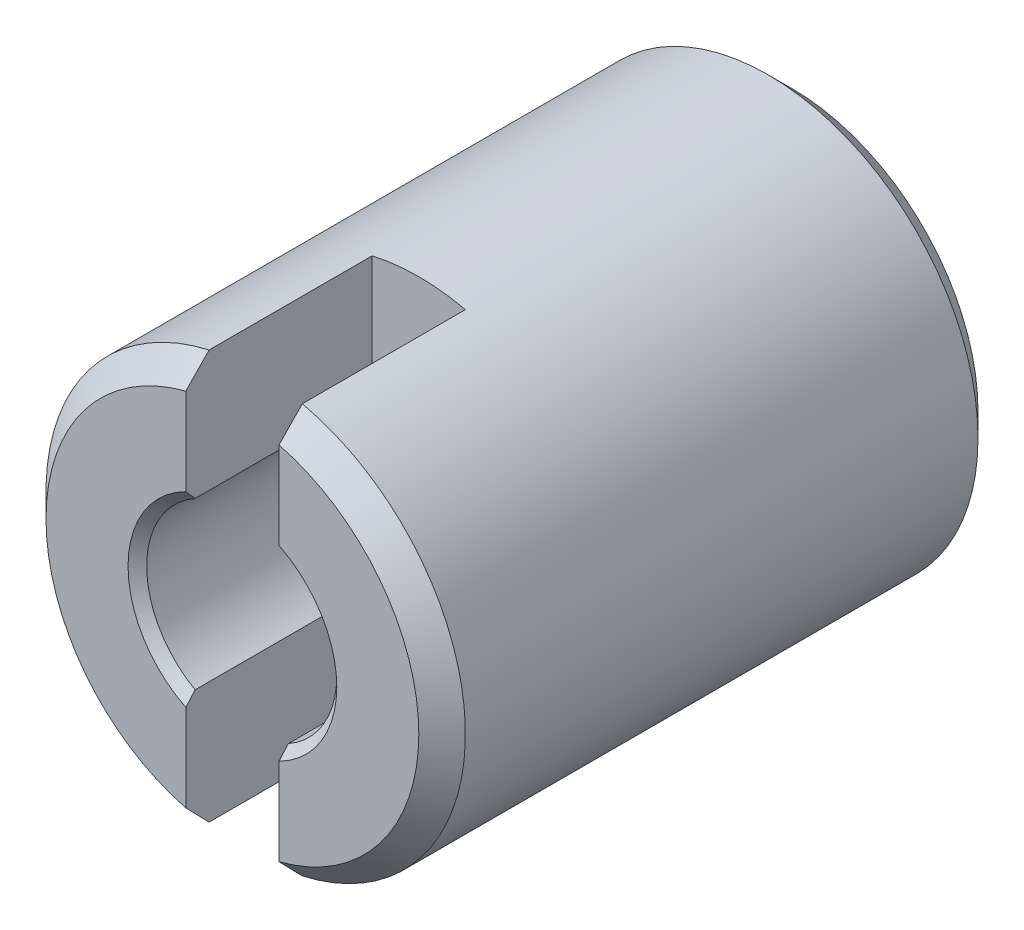
ISO-10303-21;
HEADER;
FILE_DESCRIPTION(('STEP AP214'),'2;1');
FILE_NAME('part.step','',(''),(''),'','','');
FILE_SCHEMA(('AUTOMOTIVE_DESIGN { 1 0 10303 214 1 1 1 1 }'));
ENDSEC;
DATA;
#1=APPLICATION_CONTEXT('core data for automotive mechanical design processes');
#2=APPLICATION_PROTOCOL_DEFINITION('international standard','automotive_design',2000,#1);
#3=PRODUCT_CONTEXT('',#1,'mechanical');
#4=PRODUCT('Part','Part','',(#3));
#5=PRODUCT_RELATED_PRODUCT_CATEGORY('part','',(#4));
#6=PRODUCT_DEFINITION_FORMATION('','',#4);
#7=PRODUCT_DEFINITION_CONTEXT('part definition',#1,'design');
#8=PRODUCT_DEFINITION('design','',#6,#7);
#9=PRODUCT_DEFINITION_SHAPE('','',#8);
#10=(LENGTH_UNIT() NAMED_UNIT(*) SI_UNIT(.MILLI.,.METRE.));
#11=(NAMED_UNIT(*) PLANE_ANGLE_UNIT() SI_UNIT($,.RADIAN.));
#12=(NAMED_UNIT(*) SI_UNIT($,.STERADIAN.) SOLID_ANGLE_UNIT());
#13=UNCERTAINTY_MEASURE_WITH_UNIT(LENGTH_MEASURE(1.E-05),#10,'distance_accuracy_value','');
#14=(GEOMETRIC_REPRESENTATION_CONTEXT(3) GLOBAL_UNCERTAINTY_ASSIGNED_CONTEXT((#13)) GLOBAL_UNIT_ASSIGNED_CONTEXT((#10,
#11,#12)) REPRESENTATION_CONTEXT('',''));
#15=CARTESIAN_POINT('',(0.,0.,0.));
#16=DIRECTION('',(0.,0.,1.));
#17=DIRECTION('',(1.,0.,0.));
#18=AXIS2_PLACEMENT_3D('',#15,#16,#17);
#19=CARTESIAN_POINT('',(0.,0.,6.));
#20=DIRECTION('',(0.,0.,1.));
#21=DIRECTION('',(1.,0.,0.));
#22=AXIS2_PLACEMENT_3D('',#19,#20,#21);
#23=PLANE('',#22);
#24=DIRECTION('',(0.,-1.,0.));
#25=VECTOR('',#24,1.);
#26=CARTESIAN_POINT('',(-0.5,-2.5,6.));
#27=LINE('',#26,#25);
#28=CARTESIAN_POINT('',(-0.5,-1.00219758530941,6.));
#29=VERTEX_POINT('',#28);
#30=CARTESIAN_POINT('',(-0.5,-1.93649167310371,6.));
#31=VERTEX_POINT('',#30);
#32=EDGE_CURVE('E166',#29,#31,#27,.T.);
#33=ORIENTED_EDGE('',*,*,#32,.F.);
#34=CARTESIAN_POINT('',(0.,0.,6.));
#35=DIRECTION('',(0.,0.,1.));
#36=DIRECTION('',(1.,0.,0.));
#37=AXIS2_PLACEMENT_3D('',#34,#35,#36);
#38=CIRCLE('',#37,1.12);
#39=CARTESIAN_POINT('',(-0.5,1.00219758530941,6.));
#40=VERTEX_POINT('',#39);
#41=EDGE_CURVE('E50',#29,#40,#38,.F.);
#42=ORIENTED_EDGE('',*,*,#41,.T.);
#43=CARTESIAN_POINT('',(-0.5,1.93649167310371,6.));
#44=VERTEX_POINT('',#43);
#45=EDGE_CURVE('E168',#44,#40,#27,.T.);
#46=ORIENTED_EDGE('',*,*,#45,.F.);
#47=CARTESIAN_POINT('',(0.,0.,6.));
#48=DIRECTION('',(0.,0.,1.));
#49=DIRECTION('',(1.,0.,0.));
#50=AXIS2_PLACEMENT_3D('',#47,#48,#49);
#51=CIRCLE('',#50,2.);
#52=EDGE_CURVE('E275',#44,#31,#51,.T.);
#53=ORIENTED_EDGE('',*,*,#52,.T.);
#54=EDGE_LOOP('',(#33,#42,#46,#53));
#55=FACE_BOUND('',#54,.T.);
#56=ADVANCED_FACE('F36',(#55),#23,.T.);
#57=CARTESIAN_POINT('',(0.,0.,6.));
#58=DIRECTION('',(0.,0.,-1.));
#59=DIRECTION('',(-1.,0.,0.));
#60=AXIS2_PLACEMENT_3D('',#57,#58,#59);
#61=CYLINDRICAL_SURFACE('',#60,2.25);
#62=CARTESIAN_POINT('',(0.,0.,0.249999999999999));
#63=DIRECTION('',(0.,0.,1.));
#64=DIRECTION('',(1.,0.,0.));
#65=AXIS2_PLACEMENT_3D('',#62,#63,#64);
#66=CIRCLE('',#65,2.25);
#67=CARTESIAN_POINT('',(2.25,0.,0.249999999999999));
#68=VERTEX_POINT('',#67);
#69=EDGE_CURVE('E298',#68,#68,#66,.T.);
#70=ORIENTED_EDGE('',*,*,#69,.T.);
#71=EDGE_LOOP('',(#70));
#72=FACE_BOUND('',#71,.T.);
#73=DIRECTION('',(0.,0.,-1.));
#74=VECTOR('',#73,1.);
#75=CARTESIAN_POINT('',(-0.5,-2.19374109684803,6.));
#76=LINE('',#75,#74);
#77=CARTESIAN_POINT('',(-0.5,-2.19374109684803,4.));
#78=VERTEX_POINT('',#77);
#79=CARTESIAN_POINT('',(-0.5,-2.19374109684803,5.75));
#80=VERTEX_POINT('',#79);
#81=EDGE_CURVE('E142',#78,#80,#76,.F.);
#82=ORIENTED_EDGE('',*,*,#81,.T.);
#83=CARTESIAN_POINT('',(0.,0.,5.75));
#84=DIRECTION('',(0.,0.,1.));
#85=DIRECTION('',(1.,0.,0.));
#86=AXIS2_PLACEMENT_3D('',#83,#84,#85);
#87=CIRCLE('',#86,2.25);
#88=CARTESIAN_POINT('',(-0.5,2.19374109684803,5.75));
#89=VERTEX_POINT('',#88);
#90=EDGE_CURVE('E137',#80,#89,#87,.F.);
#91=ORIENTED_EDGE('',*,*,#90,.T.);
#92=DIRECTION('',(0.,0.,-1.));
#93=VECTOR('',#92,1.);
#94=CARTESIAN_POINT('',(-0.5,2.19374109684803,6.));
#95=LINE('',#94,#93);
#96=CARTESIAN_POINT('',(-0.5,2.19374109684803,4.));
#97=VERTEX_POINT('',#96);
#98=EDGE_CURVE('E130',#89,#97,#95,.T.);
#99=ORIENTED_EDGE('',*,*,#98,.T.);
#100=CARTESIAN_POINT('',(0.,0.,4.));
#101=DIRECTION('',(0.,0.,1.));
#102=DIRECTION('',(1.,0.,0.));
#103=AXIS2_PLACEMENT_3D('',#100,#101,#102);
#104=CIRCLE('',#103,2.25);
#105=CARTESIAN_POINT('',(0.5,2.19374109684803,4.));
#106=VERTEX_POINT('',#105);
#107=EDGE_CURVE('E135',#106,#97,#104,.T.);
#108=ORIENTED_EDGE('',*,*,#107,.F.);
#109=DIRECTION('',(0.,0.,-1.));
#110=VECTOR('',#109,1.);
#111=CARTESIAN_POINT('',(0.5,2.19374109684803,6.));
#112=LINE('',#111,#110);
#113=CARTESIAN_POINT('',(0.5,2.19374109684803,5.75));
#114=VERTEX_POINT('',#113);
#115=EDGE_CURVE('E152',#106,#114,#112,.F.);
#116=ORIENTED_EDGE('',*,*,#115,.T.);
#117=CARTESIAN_POINT('',(0.,0.,5.75));
#118=DIRECTION('',(0.,0.,1.));
#119=DIRECTION('',(1.,0.,0.));
#120=AXIS2_PLACEMENT_3D('',#117,#118,#119);
#121=CIRCLE('',#120,2.25);
#122=CARTESIAN_POINT('',(0.5,-2.19374109684803,5.75));
#123=VERTEX_POINT('',#122);
#124=EDGE_CURVE('E197',#114,#123,#121,.F.);
#125=ORIENTED_EDGE('',*,*,#124,.T.);
#126=DIRECTION('',(0.,0.,-1.));
#127=VECTOR('',#126,1.);
#128=CARTESIAN_POINT('',(0.5,-2.19374109684803,6.));
#129=LINE('',#128,#127);
#130=CARTESIAN_POINT('',(0.5,-2.19374109684803,4.));
#131=VERTEX_POINT('',#130);
#132=EDGE_CURVE('E173',#123,#131,#129,.T.);
#133=ORIENTED_EDGE('',*,*,#132,.T.);
#134=EDGE_CURVE('E153',#78,#131,#104,.T.);
#135=ORIENTED_EDGE('',*,*,#134,.F.);
#136=EDGE_LOOP('',(#82,#91,#99,#108,#116,#125,#133,#135));
#137=FACE_BOUND('',#136,.T.);
#138=ADVANCED_FACE('F133',(#72,#137),#61,.T.);
#139=DIRECTION('',(0.,1.,0.));
#140=VECTOR('',#139,1.);
#141=CARTESIAN_POINT('',(0.5,-2.5,6.));
#142=LINE('',#141,#140);
#143=CARTESIAN_POINT('',(0.5,1.00219758530941,6.));
#144=VERTEX_POINT('',#143);
#145=CARTESIAN_POINT('',(0.5,1.93649167310371,6.));
#146=VERTEX_POINT('',#145);
#147=EDGE_CURVE('E169',#144,#146,#142,.T.);
#148=ORIENTED_EDGE('',*,*,#147,.F.);
#149=CARTESIAN_POINT('',(0.,0.,6.));
#150=DIRECTION('',(0.,0.,1.));
#151=DIRECTION('',(1.,0.,0.));
#152=AXIS2_PLACEMENT_3D('',#149,#150,#151);
#153=CIRCLE('',#152,1.12);
#154=CARTESIAN_POINT('',(0.5,-1.00219758530941,6.));
#155=VERTEX_POINT('',#154);
#156=EDGE_CURVE('E231',#144,#155,#153,.F.);
#157=ORIENTED_EDGE('',*,*,#156,.T.);
#158=CARTESIAN_POINT('',(0.5,-1.93649167310371,6.));
#159=VERTEX_POINT('',#158);
#160=EDGE_CURVE('E164',#159,#155,#142,.T.);
#161=ORIENTED_EDGE('',*,*,#160,.F.);
#162=CARTESIAN_POINT('',(0.,0.,6.));
#163=DIRECTION('',(0.,0.,1.));
#164=DIRECTION('',(1.,0.,0.));
#165=AXIS2_PLACEMENT_3D('',#162,#163,#164);
#166=CIRCLE('',#165,2.);
#167=EDGE_CURVE('E186',#159,#146,#166,.T.);
#168=ORIENTED_EDGE('',*,*,#167,.T.);
#169=EDGE_LOOP('',(#148,#157,#161,#168));
#170=FACE_BOUND('',#169,.T.);
#171=ADVANCED_FACE('F317',(#170),#23,.T.);
#172=CARTESIAN_POINT('',(0.,0.,0.));
#173=DIRECTION('',(0.,0.,1.));
#174=DIRECTION('',(1.,0.,0.));
#175=AXIS2_PLACEMENT_3D('',#172,#173,#174);
#176=PLANE('',#175);
#177=CARTESIAN_POINT('',(0.,0.,0.));
#178=DIRECTION('',(0.,0.,1.));
#179=DIRECTION('',(1.,0.,0.));
#180=AXIS2_PLACEMENT_3D('',#177,#178,#179);
#181=CIRCLE('',#180,1.12);
#182=CARTESIAN_POINT('',(1.12,0.,0.));
#183=VERTEX_POINT('',#182);
#184=EDGE_CURVE('E304',#183,#183,#181,.T.);
#185=ORIENTED_EDGE('',*,*,#184,.T.);
#186=EDGE_LOOP('',(#185));
#187=FACE_BOUND('',#186,.T.);
#188=CARTESIAN_POINT('',(0.,0.,0.));
#189=DIRECTION('',(0.,0.,1.));
#190=DIRECTION('',(1.,0.,0.));
#191=AXIS2_PLACEMENT_3D('',#188,#189,#190);
#192=CIRCLE('',#191,2.);
#193=CARTESIAN_POINT('',(2.,0.,0.));
#194=VERTEX_POINT('',#193);
#195=EDGE_CURVE('E301',#194,#194,#192,.F.);
#196=ORIENTED_EDGE('',*,*,#195,.T.);
#197=EDGE_LOOP('',(#196));
#198=FACE_BOUND('',#197,.T.);
#199=ADVANCED_FACE('F320',(#187,#198),#176,.F.);
#200=CARTESIAN_POINT('',(0.,0.,0.));
#201=DIRECTION('',(0.,0.,1.));
#202=DIRECTION('',(1.,0.,0.));
#203=AXIS2_PLACEMENT_3D('',#200,#201,#202);
#204=CYLINDRICAL_SURFACE('',#203,1.02);
#205=CARTESIAN_POINT('',(0.,0.,0.100000000000001));
#206=DIRECTION('',(0.,0.,1.));
#207=DIRECTION('',(1.,0.,0.));
#208=AXIS2_PLACEMENT_3D('',#205,#206,#207);
#209=CIRCLE('',#208,1.02);
#210=CARTESIAN_POINT('',(1.02,0.,0.100000000000001));
#211=VERTEX_POINT('',#210);
#212=EDGE_CURVE('E306',#211,#211,#209,.F.);
#213=ORIENTED_EDGE('',*,*,#212,.T.);
#214=EDGE_LOOP('',(#213));
#215=FACE_BOUND('',#214,.T.);
#216=DIRECTION('',(0.,0.,1.));
#217=VECTOR('',#216,1.);
#218=CARTESIAN_POINT('',(-0.5,0.889044430835715,0.));
#219=LINE('',#218,#217);
#220=CARTESIAN_POINT('',(-0.5,0.889044430835715,4.));
#221=VERTEX_POINT('',#220);
#222=CARTESIAN_POINT('',(-0.5,0.889044430835715,5.9));
#223=VERTEX_POINT('',#222);
#224=EDGE_CURVE('E157',#221,#223,#219,.T.);
#225=ORIENTED_EDGE('',*,*,#224,.T.);
#226=CARTESIAN_POINT('',(0.,0.,5.9));
#227=DIRECTION('',(0.,0.,1.));
#228=DIRECTION('',(1.,0.,0.));
#229=AXIS2_PLACEMENT_3D('',#226,#227,#228);
#230=CIRCLE('',#229,1.02);
#231=CARTESIAN_POINT('',(-0.5,-0.889044430835715,5.9));
#232=VERTEX_POINT('',#231);
#233=EDGE_CURVE('E248',#223,#232,#230,.T.);
#234=ORIENTED_EDGE('',*,*,#233,.T.);
#235=DIRECTION('',(0.,0.,1.));
#236=VECTOR('',#235,1.);
#237=CARTESIAN_POINT('',(-0.5,-0.889044430835715,0.));
#238=LINE('',#237,#236);
#239=CARTESIAN_POINT('',(-0.5,-0.889044430835715,4.));
#240=VERTEX_POINT('',#239);
#241=EDGE_CURVE('E184',#232,#240,#238,.F.);
#242=ORIENTED_EDGE('',*,*,#241,.T.);
#243=CARTESIAN_POINT('',(0.,0.,4.));
#244=DIRECTION('',(0.,0.,1.));
#245=DIRECTION('',(1.,0.,0.));
#246=AXIS2_PLACEMENT_3D('',#243,#244,#245);
#247=CIRCLE('',#246,1.02);
#248=CARTESIAN_POINT('',(0.5,-0.889044430835715,4.));
#249=VERTEX_POINT('',#248);
#250=EDGE_CURVE('E178',#249,#240,#247,.F.);
#251=ORIENTED_EDGE('',*,*,#250,.F.);
#252=DIRECTION('',(0.,0.,1.));
#253=VECTOR('',#252,1.);
#254=CARTESIAN_POINT('',(0.5,-0.889044430835715,0.));
#255=LINE('',#254,#253);
#256=CARTESIAN_POINT('',(0.5,-0.889044430835715,5.9));
#257=VERTEX_POINT('',#256);
#258=EDGE_CURVE('E181',#249,#257,#255,.T.);
#259=ORIENTED_EDGE('',*,*,#258,.T.);
#260=CARTESIAN_POINT('',(0.,0.,5.9));
#261=DIRECTION('',(0.,0.,1.));
#262=DIRECTION('',(1.,0.,0.));
#263=AXIS2_PLACEMENT_3D('',#260,#261,#262);
#264=CIRCLE('',#263,1.02);
#265=CARTESIAN_POINT('',(0.5,0.889044430835715,5.9));
#266=VERTEX_POINT('',#265);
#267=EDGE_CURVE('E232',#257,#266,#264,.T.);
#268=ORIENTED_EDGE('',*,*,#267,.T.);
#269=DIRECTION('',(0.,0.,1.));
#270=VECTOR('',#269,1.);
#271=CARTESIAN_POINT('',(0.5,0.889044430835715,0.));
#272=LINE('',#271,#270);
#273=CARTESIAN_POINT('',(0.5,0.889044430835715,4.));
#274=VERTEX_POINT('',#273);
#275=EDGE_CURVE('E177',#266,#274,#272,.F.);
#276=ORIENTED_EDGE('',*,*,#275,.T.);
#277=EDGE_CURVE('E141',#221,#274,#247,.F.);
#278=ORIENTED_EDGE('',*,*,#277,.F.);
#279=EDGE_LOOP('',(#225,#234,#242,#251,#259,#268,#276,#278));
#280=FACE_BOUND('',#279,.T.);
#281=ADVANCED_FACE('F257',(#215,#280),#204,.F.);
#282=CARTESIAN_POINT('',(0.,0.,4.));
#283=DIRECTION('',(0.,0.,1.));
#284=DIRECTION('',(1.,0.,0.));
#285=AXIS2_PLACEMENT_3D('',#282,#283,#284);
#286=PLANE('',#285);
#287=ORIENTED_EDGE('',*,*,#107,.T.);
#288=DIRECTION('',(0.,-1.,0.));
#289=VECTOR('',#288,1.);
#290=CARTESIAN_POINT('',(-0.5,-2.5,4.));
#291=LINE('',#290,#289);
#292=EDGE_CURVE('E148',#97,#221,#291,.T.);
#293=ORIENTED_EDGE('',*,*,#292,.T.);
#294=ORIENTED_EDGE('',*,*,#277,.T.);
#295=DIRECTION('',(0.,1.,0.));
#296=VECTOR('',#295,1.);
#297=CARTESIAN_POINT('',(0.5,-2.5,4.));
#298=LINE('',#297,#296);
#299=EDGE_CURVE('E151',#274,#106,#298,.T.);
#300=ORIENTED_EDGE('',*,*,#299,.T.);
#301=EDGE_LOOP('',(#287,#293,#294,#300));
#302=FACE_BOUND('',#301,.T.);
#303=ADVANCED_FACE('F146',(#302),#286,.T.);
#304=CARTESIAN_POINT('',(0.5,-2.5,4.));
#305=DIRECTION('',(1.,0.,0.));
#306=DIRECTION('',(0.,0.,-1.));
#307=AXIS2_PLACEMENT_3D('',#304,#305,#306);
#308=PLANE('',#307);
#309=ORIENTED_EDGE('',*,*,#275,.F.);
#310=CARTESIAN_POINT('',(0.5,0.889044430835715,5.9));
#311=CARTESIAN_POINT('',(0.5,0.908011648005069,5.91654407483949));
#312=CARTESIAN_POINT('',(0.5,0.926924690759326,5.93314944973838));
#313=CARTESIAN_POINT('',(0.5,0.964642408810204,5.96648278319281));
#314=CARTESIAN_POINT('',(0.5,0.983447084213843,5.98321074162725));
#315=CARTESIAN_POINT('',(0.5,1.00219758530941,6.));
#316=B_SPLINE_CURVE_WITH_KNOTS('',3,(#310,#311,#312,#313,#314,#315),.UNSPECIFIED.,.F.,.F.,(4,2,
4),(0.,0.0755048008792386,0.151009527180222),.UNSPECIFIED.);
#317=EDGE_CURVE('E224',#266,#144,#316,.T.);
#318=ORIENTED_EDGE('',*,*,#317,.T.);
#319=ORIENTED_EDGE('',*,*,#147,.T.);
#320=CARTESIAN_POINT('',(0.5,1.93649167310371,6.));
#321=CARTESIAN_POINT('',(0.5,1.97943865286244,5.95840749539172));
#322=CARTESIAN_POINT('',(0.5,2.0223495956623,5.91677790883581));
#323=CARTESIAN_POINT('',(0.5,2.10809940357073,5.83344457549595));
#324=CARTESIAN_POINT('',(0.5,2.15093826868565,5.79174082871852));
#325=CARTESIAN_POINT('',(0.5,2.19374109684803,5.75));
#326=B_SPLINE_CURVE_WITH_KNOTS('',3,(#320,#321,#322,#323,#324,#325),.UNSPECIFIED.,.F.,.F.,(4,2,
4),(0.,0.179358142829064,0.358716269872396),.UNSPECIFIED.);
#327=EDGE_CURVE('E189',#146,#114,#326,.T.);
#328=ORIENTED_EDGE('',*,*,#327,.T.);
#329=ORIENTED_EDGE('',*,*,#115,.F.);
#330=ORIENTED_EDGE('',*,*,#299,.F.);
#331=EDGE_LOOP('',(#309,#318,#319,#328,#329,#330));
#332=FACE_BOUND('',#331,.T.);
#333=ADVANCED_FACE('F210',(#332),#308,.F.);
#334=CARTESIAN_POINT('',(-0.5,-2.5,4.));
#335=DIRECTION('',(-1.,0.,0.));
#336=DIRECTION('',(0.,-1.,0.));
#337=AXIS2_PLACEMENT_3D('',#334,#335,#336);
#338=PLANE('',#337);
#339=ORIENTED_EDGE('',*,*,#45,.T.);
#340=CARTESIAN_POINT('',(-0.5,1.00219758530941,6.));
#341=CARTESIAN_POINT('',(-0.5,0.983447084213843,5.98321074162725));
#342=CARTESIAN_POINT('',(-0.5,0.964642408810203,5.96648278319281));
#343=CARTESIAN_POINT('',(-0.5,0.926924690759326,5.93314944973838));
#344=CARTESIAN_POINT('',(-0.5,0.908011648005069,5.91654407483949));
#345=CARTESIAN_POINT('',(-0.5,0.889044430835715,5.9));
#346=B_SPLINE_CURVE_WITH_KNOTS('',3,(#340,#341,#342,#343,#344,#345),.UNSPECIFIED.,.F.,.F.,(4,2,
4),(0.,0.0755047263009838,0.151009527180222),.UNSPECIFIED.);
#347=EDGE_CURVE('E11',#40,#223,#346,.T.);
#348=ORIENTED_EDGE('',*,*,#347,.T.);
#349=ORIENTED_EDGE('',*,*,#224,.F.);
#350=ORIENTED_EDGE('',*,*,#292,.F.);
#351=ORIENTED_EDGE('',*,*,#98,.F.);
#352=CARTESIAN_POINT('',(-0.5,2.19374109684803,5.75));
#353=CARTESIAN_POINT('',(-0.5,2.15093826868565,5.79174082871852));
#354=CARTESIAN_POINT('',(-0.5,2.10809940357073,5.83344457549595));
#355=CARTESIAN_POINT('',(-0.5,2.0223495956623,5.91677790883581));
#356=CARTESIAN_POINT('',(-0.5,1.97943865286244,5.95840749539172));
#357=CARTESIAN_POINT('',(-0.5,1.93649167310371,6.));
#358=B_SPLINE_CURVE_WITH_KNOTS('',3,(#352,#353,#354,#355,#356,#357),.UNSPECIFIED.,.F.,.F.,(4,2,
4),(0.,0.179358127043332,0.358716269872397),.UNSPECIFIED.);
#359=EDGE_CURVE('E292',#89,#44,#358,.T.);
#360=ORIENTED_EDGE('',*,*,#359,.T.);
#361=EDGE_LOOP('',(#339,#348,#349,#350,#351,#360));
#362=FACE_BOUND('',#361,.T.);
#363=ADVANCED_FACE('F155',(#362),#338,.F.);
#364=ORIENTED_EDGE('',*,*,#241,.F.);
#365=CARTESIAN_POINT('',(-0.5,-0.889044430835715,5.9));
#366=CARTESIAN_POINT('',(-0.5,-0.908011648005069,5.91654407483949));
#367=CARTESIAN_POINT('',(-0.5,-0.926924690759326,5.93314944973838));
#368=CARTESIAN_POINT('',(-0.5,-0.964642408810203,5.96648278319281));
#369=CARTESIAN_POINT('',(-0.5,-0.983447084213843,5.98321074162725));
#370=CARTESIAN_POINT('',(-0.5,-1.00219758530941,6.));
#371=B_SPLINE_CURVE_WITH_KNOTS('',3,(#365,#366,#367,#368,#369,#370),.UNSPECIFIED.,.F.,.F.,(4,2,
4),(0.,0.0755048008792386,0.151009527180222),.UNSPECIFIED.);
#372=EDGE_CURVE('E64',#232,#29,#371,.T.);
#373=ORIENTED_EDGE('',*,*,#372,.T.);
#374=ORIENTED_EDGE('',*,*,#32,.T.);
#375=CARTESIAN_POINT('',(-0.5,-1.93649167310371,6.));
#376=CARTESIAN_POINT('',(-0.5,-1.97943865286244,5.95840749539172));
#377=CARTESIAN_POINT('',(-0.5,-2.0223495956623,5.91677790883581));
#378=CARTESIAN_POINT('',(-0.5,-2.10809940357073,5.83344457549595));
#379=CARTESIAN_POINT('',(-0.5,-2.15093826868565,5.79174082871852));
#380=CARTESIAN_POINT('',(-0.5,-2.19374109684803,5.75));
#381=B_SPLINE_CURVE_WITH_KNOTS('',3,(#375,#376,#377,#378,#379,#380),.UNSPECIFIED.,.F.,.F.,(4,2,
4),(0.,0.179358142829064,0.358716269872396),.UNSPECIFIED.);
#382=EDGE_CURVE('E277',#31,#80,#381,.T.);
#383=ORIENTED_EDGE('',*,*,#382,.T.);
#384=ORIENTED_EDGE('',*,*,#81,.F.);
#385=EDGE_CURVE('E159',#240,#78,#291,.T.);
#386=ORIENTED_EDGE('',*,*,#385,.F.);
#387=EDGE_LOOP('',(#364,#373,#374,#383,#384,#386));
#388=FACE_BOUND('',#387,.T.);
#389=ADVANCED_FACE('F208',(#388),#338,.F.);
#390=ORIENTED_EDGE('',*,*,#160,.T.);
#391=CARTESIAN_POINT('',(0.5,-1.00219758530941,6.));
#392=CARTESIAN_POINT('',(0.5,-0.983447084213843,5.98321074162725));
#393=CARTESIAN_POINT('',(0.5,-0.964642408810204,5.96648278319281));
#394=CARTESIAN_POINT('',(0.5,-0.926924690759326,5.93314944973838));
#395=CARTESIAN_POINT('',(0.5,-0.908011648005069,5.91654407483949));
#396=CARTESIAN_POINT('',(0.5,-0.889044430835715,5.9));
#397=B_SPLINE_CURVE_WITH_KNOTS('',3,(#391,#392,#393,#394,#395,#396),.UNSPECIFIED.,.F.,.F.,(4,2,
4),(0.,0.0755047263009837,0.151009527180222),.UNSPECIFIED.);
#398=EDGE_CURVE('E242',#155,#257,#397,.T.);
#399=ORIENTED_EDGE('',*,*,#398,.T.);
#400=ORIENTED_EDGE('',*,*,#258,.F.);
#401=EDGE_CURVE('E161',#131,#249,#298,.T.);
#402=ORIENTED_EDGE('',*,*,#401,.F.);
#403=ORIENTED_EDGE('',*,*,#132,.F.);
#404=CARTESIAN_POINT('',(0.5,-2.19374109684803,5.75));
#405=CARTESIAN_POINT('',(0.5,-2.15093826868565,5.79174082871852));
#406=CARTESIAN_POINT('',(0.5,-2.10809940357073,5.83344457549595));
#407=CARTESIAN_POINT('',(0.5,-2.0223495956623,5.91677790883581));
#408=CARTESIAN_POINT('',(0.5,-1.97943865286244,5.95840749539172));
#409=CARTESIAN_POINT('',(0.5,-1.93649167310371,6.));
#410=B_SPLINE_CURVE_WITH_KNOTS('',3,(#404,#405,#406,#407,#408,#409),.UNSPECIFIED.,.F.,.F.,(4,2,
4),(0.,0.179358127043332,0.358716269872397),.UNSPECIFIED.);
#411=EDGE_CURVE('E217',#123,#159,#410,.T.);
#412=ORIENTED_EDGE('',*,*,#411,.T.);
#413=EDGE_LOOP('',(#390,#399,#400,#402,#403,#412));
#414=FACE_BOUND('',#413,.T.);
#415=ADVANCED_FACE('F203',(#414),#308,.F.);
#416=ORIENTED_EDGE('',*,*,#134,.T.);
#417=ORIENTED_EDGE('',*,*,#401,.T.);
#418=ORIENTED_EDGE('',*,*,#250,.T.);
#419=ORIENTED_EDGE('',*,*,#385,.T.);
#420=EDGE_LOOP('',(#416,#417,#418,#419));
#421=FACE_BOUND('',#420,.T.);
#422=ADVANCED_FACE('F207',(#421),#286,.T.);
#423=CARTESIAN_POINT('',(0.,0.,6.));
#424=DIRECTION('',(0.,0.,-1.));
#425=DIRECTION('',(-1.,0.,0.));
#426=AXIS2_PLACEMENT_3D('',#423,#424,#425);
#427=CONICAL_SURFACE('',#426,2.,0.785398163397449);
#428=ORIENTED_EDGE('',*,*,#411,.F.);
#429=ORIENTED_EDGE('',*,*,#124,.F.);
#430=ORIENTED_EDGE('',*,*,#327,.F.);
#431=ORIENTED_EDGE('',*,*,#167,.F.);
#432=EDGE_LOOP('',(#428,#429,#430,#431));
#433=FACE_BOUND('',#432,.T.);
#434=ADVANCED_FACE('F199',(#433),#427,.T.);
#435=CARTESIAN_POINT('',(0.,0.,6.));
#436=DIRECTION('',(0.,0.,-1.));
#437=DIRECTION('',(-1.,0.,0.));
#438=AXIS2_PLACEMENT_3D('',#435,#436,#437);
#439=CONICAL_SURFACE('',#438,2.,0.785398163397449);
#440=ORIENTED_EDGE('',*,*,#359,.F.);
#441=ORIENTED_EDGE('',*,*,#90,.F.);
#442=ORIENTED_EDGE('',*,*,#382,.F.);
#443=ORIENTED_EDGE('',*,*,#52,.F.);
#444=EDGE_LOOP('',(#440,#441,#442,#443));
#445=FACE_BOUND('',#444,.T.);
#446=ADVANCED_FACE('F286',(#445),#439,.T.);
#447=CARTESIAN_POINT('',(0.,0.,0.249999999999999));
#448=DIRECTION('',(0.,0.,1.));
#449=DIRECTION('',(1.,0.,0.));
#450=AXIS2_PLACEMENT_3D('',#447,#448,#449);
#451=CONICAL_SURFACE('',#450,2.25,0.785398163397451);
#452=ORIENTED_EDGE('',*,*,#195,.F.);
#453=EDGE_LOOP('',(#452));
#454=FACE_BOUND('',#453,.T.);
#455=ORIENTED_EDGE('',*,*,#69,.F.);
#456=EDGE_LOOP('',(#455));
#457=FACE_BOUND('',#456,.T.);
#458=ADVANCED_FACE('F289',(#454,#457),#451,.T.);
#459=CARTESIAN_POINT('',(0.,0.,0.));
#460=DIRECTION('',(0.,0.,-1.));
#461=DIRECTION('',(-1.,0.,0.));
#462=AXIS2_PLACEMENT_3D('',#459,#460,#461);
#463=CONICAL_SURFACE('',#462,1.12,0.785398163397449);
#464=ORIENTED_EDGE('',*,*,#212,.F.);
#465=EDGE_LOOP('',(#464));
#466=FACE_BOUND('',#465,.T.);
#467=ORIENTED_EDGE('',*,*,#184,.F.);
#468=EDGE_LOOP('',(#467));
#469=FACE_BOUND('',#468,.T.);
#470=ADVANCED_FACE('F238',(#466,#469),#463,.F.);
#471=CARTESIAN_POINT('',(0.,0.,5.9));
#472=DIRECTION('',(0.,0.,1.));
#473=DIRECTION('',(1.,0.,0.));
#474=AXIS2_PLACEMENT_3D('',#471,#472,#473);
#475=CONICAL_SURFACE('',#474,1.02,0.785398163397448);
#476=ORIENTED_EDGE('',*,*,#398,.F.);
#477=ORIENTED_EDGE('',*,*,#156,.F.);
#478=ORIENTED_EDGE('',*,*,#317,.F.);
#479=ORIENTED_EDGE('',*,*,#267,.F.);
#480=EDGE_LOOP('',(#476,#477,#478,#479));
#481=FACE_BOUND('',#480,.T.);
#482=ADVANCED_FACE('F234',(#481),#475,.F.);
#483=CARTESIAN_POINT('',(0.,0.,5.9));
#484=DIRECTION('',(0.,0.,1.));
#485=DIRECTION('',(1.,0.,0.));
#486=AXIS2_PLACEMENT_3D('',#483,#484,#485);
#487=CONICAL_SURFACE('',#486,1.02,0.785398163397448);
#488=ORIENTED_EDGE('',*,*,#347,.F.);
#489=ORIENTED_EDGE('',*,*,#41,.F.);
#490=ORIENTED_EDGE('',*,*,#372,.F.);
#491=ORIENTED_EDGE('',*,*,#233,.F.);
#492=EDGE_LOOP('',(#488,#489,#490,#491));
#493=FACE_BOUND('',#492,.T.);
#494=ADVANCED_FACE('F38',(#493),#487,.F.);
#495=CLOSED_SHELL('',(#56,#138,#171,#199,#281,#303,#333,#363,#389,#415,#422,#434,#446,#458,#470,
#482,#494));
#496=MANIFOLD_SOLID_BREP('B2',#495);
#497=ADVANCED_BREP_SHAPE_REPRESENTATION('',(#18,#496),#14);
#498=SHAPE_DEFINITION_REPRESENTATION(#9,#497);
ENDSEC;
END-ISO-10303-21;
